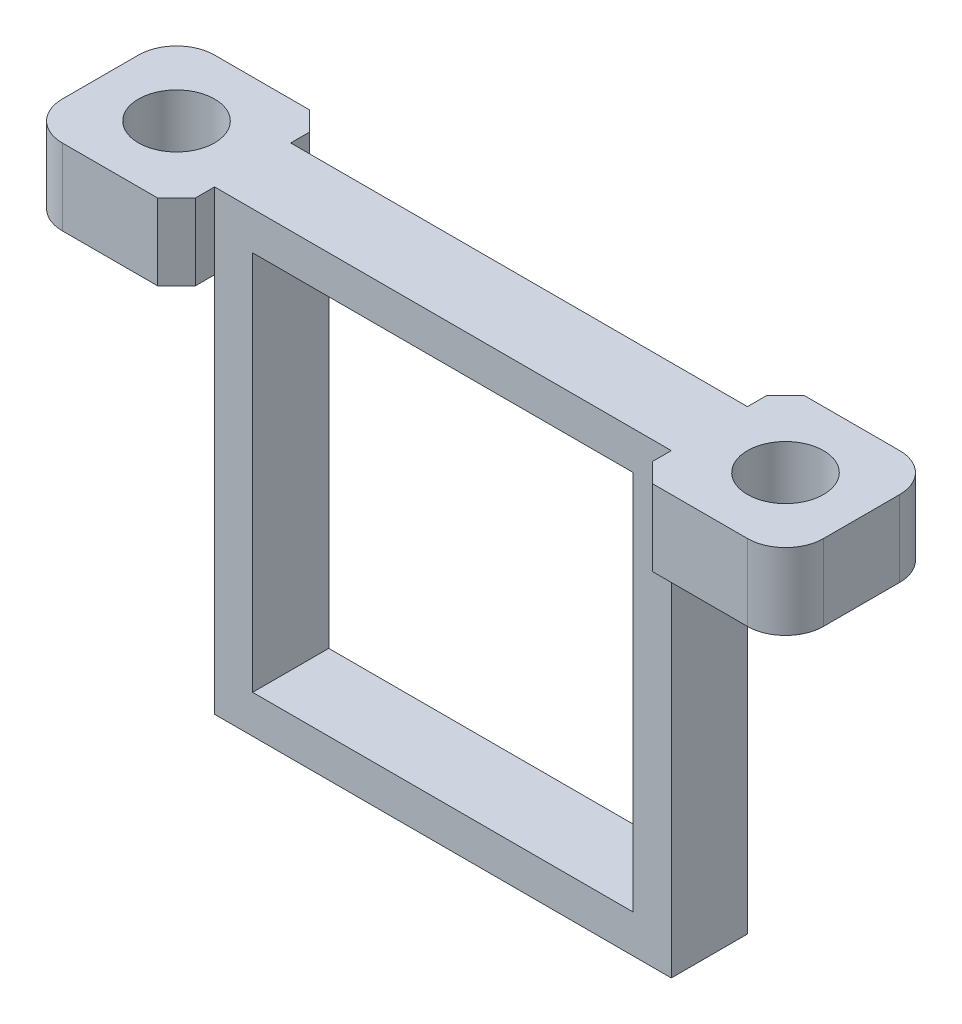
ISO-10303-21;
HEADER;
FILE_DESCRIPTION(('STEP AP214'),'2;1');
FILE_NAME('part.step','',(''),(''),'','','');
FILE_SCHEMA(('AUTOMOTIVE_DESIGN { 1 0 10303 214 1 1 1 1 }'));
ENDSEC;
DATA;
#1=APPLICATION_CONTEXT('core data for automotive mechanical design processes');
#2=APPLICATION_PROTOCOL_DEFINITION('international standard','automotive_design',2000,#1);
#3=PRODUCT_CONTEXT('',#1,'mechanical');
#4=PRODUCT('Part','Part','',(#3));
#5=PRODUCT_RELATED_PRODUCT_CATEGORY('part','',(#4));
#6=PRODUCT_DEFINITION_FORMATION('','',#4);
#7=PRODUCT_DEFINITION_CONTEXT('part definition',#1,'design');
#8=PRODUCT_DEFINITION('design','',#6,#7);
#9=PRODUCT_DEFINITION_SHAPE('','',#8);
#10=(LENGTH_UNIT() NAMED_UNIT(*) SI_UNIT(.MILLI.,.METRE.));
#11=(NAMED_UNIT(*) PLANE_ANGLE_UNIT() SI_UNIT($,.RADIAN.));
#12=(NAMED_UNIT(*) SI_UNIT($,.STERADIAN.) SOLID_ANGLE_UNIT());
#13=UNCERTAINTY_MEASURE_WITH_UNIT(LENGTH_MEASURE(1.E-05),#10,'distance_accuracy_value','');
#14=(GEOMETRIC_REPRESENTATION_CONTEXT(3) GLOBAL_UNCERTAINTY_ASSIGNED_CONTEXT((#13)) GLOBAL_UNIT_ASSIGNED_CONTEXT((#10,
#11,#12)) REPRESENTATION_CONTEXT('',''));
#15=CARTESIAN_POINT('',(0.,0.,0.));
#16=DIRECTION('',(0.,0.,1.));
#17=DIRECTION('',(1.,0.,0.));
#18=AXIS2_PLACEMENT_3D('',#15,#16,#17);
#19=CARTESIAN_POINT('',(12.,0.,4.));
#20=DIRECTION('',(-1.,0.,0.));
#21=DIRECTION('',(0.,0.,1.));
#22=AXIS2_PLACEMENT_3D('',#19,#20,#21);
#23=PLANE('',#22);
#24=DIRECTION('',(0.,0.,-1.));
#25=VECTOR('',#24,1.);
#26=CARTESIAN_POINT('',(12.,8.,-2.));
#27=LINE('',#26,#25);
#28=CARTESIAN_POINT('',(12.,8.,4.));
#29=VERTEX_POINT('',#28);
#30=CARTESIAN_POINT('',(12.,8.,0.));
#31=VERTEX_POINT('',#30);
#32=EDGE_CURVE('E276',#29,#31,#27,.T.);
#33=ORIENTED_EDGE('',*,*,#32,.F.);
#34=DIRECTION('',(0.,1.,0.));
#35=VECTOR('',#34,1.);
#36=CARTESIAN_POINT('',(12.,0.,4.));
#37=LINE('',#36,#35);
#38=CARTESIAN_POINT('',(12.,-12.,4.));
#39=VERTEX_POINT('',#38);
#40=EDGE_CURVE('E440',#39,#29,#37,.T.);
#41=ORIENTED_EDGE('',*,*,#40,.F.);
#42=DIRECTION('',(0.,0.,-1.));
#43=VECTOR('',#42,1.);
#44=CARTESIAN_POINT('',(12.,-12.,4.));
#45=LINE('',#44,#43);
#46=CARTESIAN_POINT('',(12.,-12.,0.));
#47=VERTEX_POINT('',#46);
#48=EDGE_CURVE('E444',#39,#47,#45,.T.);
#49=ORIENTED_EDGE('',*,*,#48,.T.);
#50=DIRECTION('',(0.,1.,0.));
#51=VECTOR('',#50,1.);
#52=CARTESIAN_POINT('',(12.,0.,0.));
#53=LINE('',#52,#51);
#54=EDGE_CURVE('E431',#47,#31,#53,.T.);
#55=ORIENTED_EDGE('',*,*,#54,.T.);
#56=EDGE_LOOP('',(#33,#41,#49,#55));
#57=FACE_BOUND('',#56,.T.);
#58=ADVANCED_FACE('F73',(#57),#23,.F.);
#59=CARTESIAN_POINT('',(-12.,0.,4.));
#60=DIRECTION('',(-1.,0.,0.));
#61=DIRECTION('',(0.,0.,1.));
#62=AXIS2_PLACEMENT_3D('',#59,#60,#61);
#63=PLANE('',#62);
#64=DIRECTION('',(0.,1.,0.));
#65=VECTOR('',#64,1.);
#66=CARTESIAN_POINT('',(-12.,0.,4.));
#67=LINE('',#66,#65);
#68=CARTESIAN_POINT('',(-12.,-12.,4.));
#69=VERTEX_POINT('',#68);
#70=CARTESIAN_POINT('',(-12.,8.,4.));
#71=VERTEX_POINT('',#70);
#72=EDGE_CURVE('E432',#69,#71,#67,.T.);
#73=ORIENTED_EDGE('',*,*,#72,.T.);
#74=DIRECTION('',(0.,0.,-1.));
#75=VECTOR('',#74,1.);
#76=CARTESIAN_POINT('',(-12.,8.,-2.));
#77=LINE('',#76,#75);
#78=CARTESIAN_POINT('',(-12.,8.,0.));
#79=VERTEX_POINT('',#78);
#80=EDGE_CURVE('E328',#71,#79,#77,.T.);
#81=ORIENTED_EDGE('',*,*,#80,.T.);
#82=DIRECTION('',(0.,1.,0.));
#83=VECTOR('',#82,1.);
#84=CARTESIAN_POINT('',(-12.,0.,0.));
#85=LINE('',#84,#83);
#86=CARTESIAN_POINT('',(-12.,-12.,0.));
#87=VERTEX_POINT('',#86);
#88=EDGE_CURVE('E448',#87,#79,#85,.T.);
#89=ORIENTED_EDGE('',*,*,#88,.F.);
#90=DIRECTION('',(0.,0.,-1.));
#91=VECTOR('',#90,1.);
#92=CARTESIAN_POINT('',(-12.,-12.,4.));
#93=LINE('',#92,#91);
#94=EDGE_CURVE('E461',#69,#87,#93,.T.);
#95=ORIENTED_EDGE('',*,*,#94,.F.);
#96=EDGE_LOOP('',(#73,#81,#89,#95));
#97=FACE_BOUND('',#96,.T.);
#98=ADVANCED_FACE('F553',(#97),#63,.T.);
#99=CARTESIAN_POINT('',(0.,12.,4.));
#100=DIRECTION('',(0.,1.,0.));
#101=DIRECTION('',(0.,0.,1.));
#102=AXIS2_PLACEMENT_3D('',#99,#100,#101);
#103=PLANE('',#102);
#104=DIRECTION('',(1.,0.,0.));
#105=VECTOR('',#104,1.);
#106=CARTESIAN_POINT('',(12.,12.,-2.));
#107=LINE('',#106,#105);
#108=CARTESIAN_POINT('',(13.,12.,-2.));
#109=VERTEX_POINT('',#108);
#110=CARTESIAN_POINT('',(18.,12.,-2.));
#111=VERTEX_POINT('',#110);
#112=EDGE_CURVE('E301',#109,#111,#107,.T.);
#113=ORIENTED_EDGE('',*,*,#112,.F.);
#114=DIRECTION('',(0.70710678118655,0.,-0.707106781186545));
#115=VECTOR('',#114,1.);
#116=CARTESIAN_POINT('',(3.49999999999995,12.,7.49999999999998));
#117=LINE('',#116,#115);
#118=CARTESIAN_POINT('',(12.,12.,-1.00000000000001));
#119=VERTEX_POINT('',#118);
#120=EDGE_CURVE('E497',#109,#119,#117,.F.);
#121=ORIENTED_EDGE('',*,*,#120,.T.);
#122=DIRECTION('',(0.,0.,-1.));
#123=VECTOR('',#122,1.);
#124=CARTESIAN_POINT('',(12.,12.,-2.));
#125=LINE('',#124,#123);
#126=CARTESIAN_POINT('',(12.,12.,0.));
#127=VERTEX_POINT('',#126);
#128=EDGE_CURVE('E290',#127,#119,#125,.T.);
#129=ORIENTED_EDGE('',*,*,#128,.F.);
#130=DIRECTION('',(1.,0.,0.));
#131=VECTOR('',#130,1.);
#132=CARTESIAN_POINT('',(0.,12.,0.));
#133=LINE('',#132,#131);
#134=CARTESIAN_POINT('',(-12.,12.,0.));
#135=VERTEX_POINT('',#134);
#136=EDGE_CURVE('E416',#135,#127,#133,.T.);
#137=ORIENTED_EDGE('',*,*,#136,.F.);
#138=DIRECTION('',(0.,0.,-1.));
#139=VECTOR('',#138,1.);
#140=CARTESIAN_POINT('',(-12.,12.,-2.));
#141=LINE('',#140,#139);
#142=CARTESIAN_POINT('',(-12.,12.,-1.));
#143=VERTEX_POINT('',#142);
#144=EDGE_CURVE('E319',#135,#143,#141,.T.);
#145=ORIENTED_EDGE('',*,*,#144,.T.);
#146=DIRECTION('',(0.70710678118655,0.,0.707106781186545));
#147=VECTOR('',#146,1.);
#148=CARTESIAN_POINT('',(-3.49999999999996,12.,7.49999999999998));
#149=LINE('',#148,#147);
#150=CARTESIAN_POINT('',(-13.,12.,-2.));
#151=VERTEX_POINT('',#150);
#152=EDGE_CURVE('E471',#143,#151,#149,.F.);
#153=ORIENTED_EDGE('',*,*,#152,.T.);
#154=DIRECTION('',(-1.,0.,0.));
#155=VECTOR('',#154,1.);
#156=CARTESIAN_POINT('',(-12.,12.,-2.));
#157=LINE('',#156,#155);
#158=CARTESIAN_POINT('',(-18.,12.,-2.));
#159=VERTEX_POINT('',#158);
#160=EDGE_CURVE('E351',#151,#159,#157,.T.);
#161=ORIENTED_EDGE('',*,*,#160,.T.);
#162=CARTESIAN_POINT('',(-18.,12.,0.));
#163=DIRECTION('',(0.,1.,0.));
#164=DIRECTION('',(0.,0.,1.));
#165=AXIS2_PLACEMENT_3D('',#162,#163,#164);
#166=CIRCLE('',#165,2.);
#167=CARTESIAN_POINT('',(-20.,12.,0.));
#168=VERTEX_POINT('',#167);
#169=EDGE_CURVE('E354',#159,#168,#166,.T.);
#170=ORIENTED_EDGE('',*,*,#169,.T.);
#171=DIRECTION('',(0.,0.,1.));
#172=VECTOR('',#171,1.);
#173=CARTESIAN_POINT('',(-20.,12.,0.));
#174=LINE('',#173,#172);
#175=CARTESIAN_POINT('',(-20.,12.,3.99999999999999));
#176=VERTEX_POINT('',#175);
#177=EDGE_CURVE('E358',#168,#176,#174,.T.);
#178=ORIENTED_EDGE('',*,*,#177,.T.);
#179=CARTESIAN_POINT('',(-18.,12.,4.));
#180=DIRECTION('',(0.,1.,0.));
#181=DIRECTION('',(0.,0.,1.));
#182=AXIS2_PLACEMENT_3D('',#179,#180,#181);
#183=CIRCLE('',#182,2.);
#184=CARTESIAN_POINT('',(-18.,12.,6.));
#185=VERTEX_POINT('',#184);
#186=EDGE_CURVE('E362',#176,#185,#183,.T.);
#187=ORIENTED_EDGE('',*,*,#186,.T.);
#188=DIRECTION('',(1.,0.,0.));
#189=VECTOR('',#188,1.);
#190=CARTESIAN_POINT('',(-12.,12.,6.));
#191=LINE('',#190,#189);
#192=CARTESIAN_POINT('',(-13.,12.,6.));
#193=VERTEX_POINT('',#192);
#194=EDGE_CURVE('E366',#185,#193,#191,.T.);
#195=ORIENTED_EDGE('',*,*,#194,.T.);
#196=DIRECTION('',(-0.707106781186545,0.,0.70710678118655));
#197=VECTOR('',#196,1.);
#198=CARTESIAN_POINT('',(-5.50000000000004,12.,-1.5));
#199=LINE('',#198,#197);
#200=CARTESIAN_POINT('',(-12.,12.,5.));
#201=VERTEX_POINT('',#200);
#202=EDGE_CURVE('E468',#193,#201,#199,.F.);
#203=ORIENTED_EDGE('',*,*,#202,.T.);
#204=CARTESIAN_POINT('',(-12.,12.,4.));
#205=VERTEX_POINT('',#204);
#206=EDGE_CURVE('E348',#201,#205,#141,.T.);
#207=ORIENTED_EDGE('',*,*,#206,.T.);
#208=DIRECTION('',(1.,0.,0.));
#209=VECTOR('',#208,1.);
#210=CARTESIAN_POINT('',(0.,12.,4.));
#211=LINE('',#210,#209);
#212=CARTESIAN_POINT('',(12.,12.,4.));
#213=VERTEX_POINT('',#212);
#214=EDGE_CURVE('E426',#205,#213,#211,.T.);
#215=ORIENTED_EDGE('',*,*,#214,.T.);
#216=CARTESIAN_POINT('',(12.,12.,5.));
#217=VERTEX_POINT('',#216);
#218=EDGE_CURVE('E286',#217,#213,#125,.T.);
#219=ORIENTED_EDGE('',*,*,#218,.F.);
#220=DIRECTION('',(-0.707106781186548,0.,-0.707106781186548));
#221=VECTOR('',#220,1.);
#222=CARTESIAN_POINT('',(5.5,12.,-1.5));
#223=LINE('',#222,#221);
#224=CARTESIAN_POINT('',(13.,12.,6.));
#225=VERTEX_POINT('',#224);
#226=EDGE_CURVE('E494',#217,#225,#223,.F.);
#227=ORIENTED_EDGE('',*,*,#226,.T.);
#228=DIRECTION('',(-1.,0.,0.));
#229=VECTOR('',#228,1.);
#230=CARTESIAN_POINT('',(12.,12.,6.));
#231=LINE('',#230,#229);
#232=CARTESIAN_POINT('',(18.,12.,6.));
#233=VERTEX_POINT('',#232);
#234=EDGE_CURVE('E289',#233,#225,#231,.T.);
#235=ORIENTED_EDGE('',*,*,#234,.F.);
#236=CARTESIAN_POINT('',(18.,12.,4.));
#237=DIRECTION('',(0.,-1.,0.));
#238=DIRECTION('',(0.,0.,1.));
#239=AXIS2_PLACEMENT_3D('',#236,#237,#238);
#240=CIRCLE('',#239,2.);
#241=CARTESIAN_POINT('',(20.,12.,3.99999999999999));
#242=VERTEX_POINT('',#241);
#243=EDGE_CURVE('E263',#242,#233,#240,.T.);
#244=ORIENTED_EDGE('',*,*,#243,.F.);
#245=DIRECTION('',(0.,0.,1.));
#246=VECTOR('',#245,1.);
#247=CARTESIAN_POINT('',(20.,12.,0.));
#248=LINE('',#247,#246);
#249=CARTESIAN_POINT('',(20.,12.,0.));
#250=VERTEX_POINT('',#249);
#251=EDGE_CURVE('E295',#250,#242,#248,.T.);
#252=ORIENTED_EDGE('',*,*,#251,.F.);
#253=CARTESIAN_POINT('',(18.,12.,0.));
#254=DIRECTION('',(0.,-1.,0.));
#255=DIRECTION('',(0.,0.,1.));
#256=AXIS2_PLACEMENT_3D('',#253,#254,#255);
#257=CIRCLE('',#256,2.);
#258=EDGE_CURVE('E298',#111,#250,#257,.T.);
#259=ORIENTED_EDGE('',*,*,#258,.F.);
#260=EDGE_LOOP('',(#113,#121,#129,#137,#145,#153,#161,#170,#178,#187,#195,#203,#207,#215,#219,
#227,#235,#244,#252,#259));
#261=FACE_BOUND('',#260,.T.);
#262=CARTESIAN_POINT('',(-16.,12.,2.));
#263=DIRECTION('',(0.,1.,0.));
#264=DIRECTION('',(0.,0.,1.));
#265=AXIS2_PLACEMENT_3D('',#262,#263,#264);
#266=CIRCLE('',#265,2.);
#267=CARTESIAN_POINT('',(-16.,12.,4.));
#268=VERTEX_POINT('',#267);
#269=EDGE_CURVE('E308',#268,#268,#266,.T.);
#270=ORIENTED_EDGE('',*,*,#269,.F.);
#271=EDGE_LOOP('',(#270));
#272=FACE_BOUND('',#271,.T.);
#273=CARTESIAN_POINT('',(16.,12.,2.));
#274=DIRECTION('',(0.,-1.,0.));
#275=DIRECTION('',(0.,0.,1.));
#276=AXIS2_PLACEMENT_3D('',#273,#274,#275);
#277=CIRCLE('',#276,2.);
#278=CARTESIAN_POINT('',(16.,12.,4.));
#279=VERTEX_POINT('',#278);
#280=EDGE_CURVE('E918',#279,#279,#277,.T.);
#281=ORIENTED_EDGE('',*,*,#280,.T.);
#282=EDGE_LOOP('',(#281));
#283=FACE_BOUND('',#282,.T.);
#284=ADVANCED_FACE('F518',(#261,#272,#283),#103,.T.);
#285=CARTESIAN_POINT('',(0.,-12.,4.));
#286=DIRECTION('',(0.,1.,0.));
#287=DIRECTION('',(0.,0.,1.));
#288=AXIS2_PLACEMENT_3D('',#285,#286,#287);
#289=PLANE('',#288);
#290=DIRECTION('',(1.,0.,0.));
#291=VECTOR('',#290,1.);
#292=CARTESIAN_POINT('',(0.,-12.,0.));
#293=LINE('',#292,#291);
#294=EDGE_CURVE('E452',#87,#47,#293,.T.);
#295=ORIENTED_EDGE('',*,*,#294,.T.);
#296=ORIENTED_EDGE('',*,*,#48,.F.);
#297=DIRECTION('',(1.,0.,0.));
#298=VECTOR('',#297,1.);
#299=CARTESIAN_POINT('',(0.,-12.,4.));
#300=LINE('',#299,#298);
#301=EDGE_CURVE('E436',#69,#39,#300,.T.);
#302=ORIENTED_EDGE('',*,*,#301,.F.);
#303=ORIENTED_EDGE('',*,*,#94,.T.);
#304=EDGE_LOOP('',(#295,#296,#302,#303));
#305=FACE_BOUND('',#304,.T.);
#306=ADVANCED_FACE('F600',(#305),#289,.F.);
#307=CARTESIAN_POINT('',(0.,0.,4.));
#308=DIRECTION('',(0.,0.,1.));
#309=DIRECTION('',(1.,0.,0.));
#310=AXIS2_PLACEMENT_3D('',#307,#308,#309);
#311=PLANE('',#310);
#312=DIRECTION('',(1.,0.,0.));
#313=VECTOR('',#312,1.);
#314=CARTESIAN_POINT('',(-10.,10.,4.));
#315=LINE('',#314,#313);
#316=CARTESIAN_POINT('',(-10.,10.,4.));
#317=VERTEX_POINT('',#316);
#318=CARTESIAN_POINT('',(10.,10.,4.));
#319=VERTEX_POINT('',#318);
#320=EDGE_CURVE('E383',#317,#319,#315,.T.);
#321=ORIENTED_EDGE('',*,*,#320,.T.);
#322=DIRECTION('',(0.,1.,0.));
#323=VECTOR('',#322,1.);
#324=CARTESIAN_POINT('',(10.,-10.,4.));
#325=LINE('',#324,#323);
#326=CARTESIAN_POINT('',(10.,-10.,4.));
#327=VERTEX_POINT('',#326);
#328=EDGE_CURVE('E387',#327,#319,#325,.T.);
#329=ORIENTED_EDGE('',*,*,#328,.F.);
#330=DIRECTION('',(1.,0.,0.));
#331=VECTOR('',#330,1.);
#332=CARTESIAN_POINT('',(-10.,-10.,4.));
#333=LINE('',#332,#331);
#334=CARTESIAN_POINT('',(-10.,-10.,4.));
#335=VERTEX_POINT('',#334);
#336=EDGE_CURVE('E391',#335,#327,#333,.T.);
#337=ORIENTED_EDGE('',*,*,#336,.F.);
#338=DIRECTION('',(0.,1.,0.));
#339=VECTOR('',#338,1.);
#340=CARTESIAN_POINT('',(-10.,-10.,4.));
#341=LINE('',#340,#339);
#342=EDGE_CURVE('E395',#335,#317,#341,.T.);
#343=ORIENTED_EDGE('',*,*,#342,.T.);
#344=EDGE_LOOP('',(#321,#329,#337,#343));
#345=FACE_BOUND('',#344,.T.);
#346=ORIENTED_EDGE('',*,*,#214,.F.);
#347=EDGE_CURVE('E430',#71,#205,#67,.T.);
#348=ORIENTED_EDGE('',*,*,#347,.F.);
#349=ORIENTED_EDGE('',*,*,#72,.F.);
#350=ORIENTED_EDGE('',*,*,#301,.T.);
#351=ORIENTED_EDGE('',*,*,#40,.T.);
#352=EDGE_CURVE('E439',#29,#213,#37,.T.);
#353=ORIENTED_EDGE('',*,*,#352,.T.);
#354=EDGE_LOOP('',(#346,#348,#349,#350,#351,#353));
#355=FACE_BOUND('',#354,.T.);
#356=ADVANCED_FACE('F525',(#345,#355),#311,.T.);
#357=CARTESIAN_POINT('',(0.,0.,0.));
#358=DIRECTION('',(0.,0.,1.));
#359=DIRECTION('',(1.,0.,0.));
#360=AXIS2_PLACEMENT_3D('',#357,#358,#359);
#361=PLANE('',#360);
#362=DIRECTION('',(0.,1.,0.));
#363=VECTOR('',#362,1.);
#364=CARTESIAN_POINT('',(10.,-10.,0.));
#365=LINE('',#364,#363);
#366=CARTESIAN_POINT('',(10.,-10.,0.));
#367=VERTEX_POINT('',#366);
#368=CARTESIAN_POINT('',(10.,10.,0.));
#369=VERTEX_POINT('',#368);
#370=EDGE_CURVE('E402',#367,#369,#365,.T.);
#371=ORIENTED_EDGE('',*,*,#370,.T.);
#372=DIRECTION('',(1.,0.,0.));
#373=VECTOR('',#372,1.);
#374=CARTESIAN_POINT('',(-10.,10.,0.));
#375=LINE('',#374,#373);
#376=CARTESIAN_POINT('',(-10.,10.,0.));
#377=VERTEX_POINT('',#376);
#378=EDGE_CURVE('E373',#377,#369,#375,.T.);
#379=ORIENTED_EDGE('',*,*,#378,.F.);
#380=DIRECTION('',(0.,1.,0.));
#381=VECTOR('',#380,1.);
#382=CARTESIAN_POINT('',(-10.,-10.,0.));
#383=LINE('',#382,#381);
#384=CARTESIAN_POINT('',(-10.,-10.,0.));
#385=VERTEX_POINT('',#384);
#386=EDGE_CURVE('E388',#385,#377,#383,.T.);
#387=ORIENTED_EDGE('',*,*,#386,.F.);
#388=DIRECTION('',(1.,0.,0.));
#389=VECTOR('',#388,1.);
#390=CARTESIAN_POINT('',(-10.,-10.,0.));
#391=LINE('',#390,#389);
#392=EDGE_CURVE('E406',#385,#367,#391,.T.);
#393=ORIENTED_EDGE('',*,*,#392,.T.);
#394=EDGE_LOOP('',(#371,#379,#387,#393));
#395=FACE_BOUND('',#394,.T.);
#396=ORIENTED_EDGE('',*,*,#136,.T.);
#397=EDGE_CURVE('E455',#31,#127,#53,.T.);
#398=ORIENTED_EDGE('',*,*,#397,.F.);
#399=ORIENTED_EDGE('',*,*,#54,.F.);
#400=ORIENTED_EDGE('',*,*,#294,.F.);
#401=ORIENTED_EDGE('',*,*,#88,.T.);
#402=EDGE_CURVE('E447',#79,#135,#85,.T.);
#403=ORIENTED_EDGE('',*,*,#402,.T.);
#404=EDGE_LOOP('',(#396,#398,#399,#400,#401,#403));
#405=FACE_BOUND('',#404,.T.);
#406=ADVANCED_FACE('F547',(#395,#405),#361,.F.);
#407=CARTESIAN_POINT('',(-10.,10.,4.));
#408=DIRECTION('',(0.,1.,0.));
#409=DIRECTION('',(0.,0.,1.));
#410=AXIS2_PLACEMENT_3D('',#407,#408,#409);
#411=PLANE('',#410);
#412=ORIENTED_EDGE('',*,*,#378,.T.);
#413=DIRECTION('',(0.,0.,-1.));
#414=VECTOR('',#413,1.);
#415=CARTESIAN_POINT('',(10.,10.,4.));
#416=LINE('',#415,#414);
#417=EDGE_CURVE('E399',#319,#369,#416,.T.);
#418=ORIENTED_EDGE('',*,*,#417,.F.);
#419=ORIENTED_EDGE('',*,*,#320,.F.);
#420=DIRECTION('',(0.,0.,-1.));
#421=VECTOR('',#420,1.);
#422=CARTESIAN_POINT('',(-10.,10.,4.));
#423=LINE('',#422,#421);
#424=EDGE_CURVE('E413',#317,#377,#423,.T.);
#425=ORIENTED_EDGE('',*,*,#424,.T.);
#426=EDGE_LOOP('',(#412,#418,#419,#425));
#427=FACE_BOUND('',#426,.T.);
#428=ADVANCED_FACE('F671',(#427),#411,.F.);
#429=CARTESIAN_POINT('',(-10.,-10.,4.));
#430=DIRECTION('',(-1.,0.,0.));
#431=DIRECTION('',(0.,0.,1.));
#432=AXIS2_PLACEMENT_3D('',#429,#430,#431);
#433=PLANE('',#432);
#434=ORIENTED_EDGE('',*,*,#386,.T.);
#435=ORIENTED_EDGE('',*,*,#424,.F.);
#436=ORIENTED_EDGE('',*,*,#342,.F.);
#437=DIRECTION('',(0.,0.,-1.));
#438=VECTOR('',#437,1.);
#439=CARTESIAN_POINT('',(-10.,-10.,4.));
#440=LINE('',#439,#438);
#441=EDGE_CURVE('E417',#335,#385,#440,.T.);
#442=ORIENTED_EDGE('',*,*,#441,.T.);
#443=EDGE_LOOP('',(#434,#435,#436,#442));
#444=FACE_BOUND('',#443,.T.);
#445=ADVANCED_FACE('F667',(#444),#433,.F.);
#446=CARTESIAN_POINT('',(-10.,-10.,4.));
#447=DIRECTION('',(0.,1.,0.));
#448=DIRECTION('',(0.,0.,1.));
#449=AXIS2_PLACEMENT_3D('',#446,#447,#448);
#450=PLANE('',#449);
#451=ORIENTED_EDGE('',*,*,#392,.F.);
#452=ORIENTED_EDGE('',*,*,#441,.F.);
#453=ORIENTED_EDGE('',*,*,#336,.T.);
#454=DIRECTION('',(0.,0.,-1.));
#455=VECTOR('',#454,1.);
#456=CARTESIAN_POINT('',(10.,-10.,4.));
#457=LINE('',#456,#455);
#458=EDGE_CURVE('E420',#327,#367,#457,.T.);
#459=ORIENTED_EDGE('',*,*,#458,.T.);
#460=EDGE_LOOP('',(#451,#452,#453,#459));
#461=FACE_BOUND('',#460,.T.);
#462=ADVANCED_FACE('F670',(#461),#450,.T.);
#463=CARTESIAN_POINT('',(10.,-10.,4.));
#464=DIRECTION('',(-1.,0.,0.));
#465=DIRECTION('',(0.,0.,1.));
#466=AXIS2_PLACEMENT_3D('',#463,#464,#465);
#467=PLANE('',#466);
#468=ORIENTED_EDGE('',*,*,#370,.F.);
#469=ORIENTED_EDGE('',*,*,#458,.F.);
#470=ORIENTED_EDGE('',*,*,#328,.T.);
#471=ORIENTED_EDGE('',*,*,#417,.T.);
#472=EDGE_LOOP('',(#468,#469,#470,#471));
#473=FACE_BOUND('',#472,.T.);
#474=ADVANCED_FACE('F663',(#473),#467,.T.);
#475=CARTESIAN_POINT('',(-12.,8.,-2.));
#476=DIRECTION('',(1.,0.,0.));
#477=DIRECTION('',(0.,0.,-1.));
#478=AXIS2_PLACEMENT_3D('',#475,#476,#477);
#479=PLANE('',#478);
#480=CARTESIAN_POINT('',(-12.,8.,-1.));
#481=VERTEX_POINT('',#480);
#482=EDGE_CURVE('E327',#79,#481,#77,.T.);
#483=ORIENTED_EDGE('',*,*,#482,.T.);
#484=DIRECTION('',(0.,1.,0.));
#485=VECTOR('',#484,1.);
#486=CARTESIAN_POINT('',(-12.,8.,-1.));
#487=LINE('',#486,#485);
#488=EDGE_CURVE('E464',#481,#143,#487,.T.);
#489=ORIENTED_EDGE('',*,*,#488,.T.);
#490=ORIENTED_EDGE('',*,*,#144,.F.);
#491=ORIENTED_EDGE('',*,*,#402,.F.);
#492=EDGE_LOOP('',(#483,#489,#490,#491));
#493=FACE_BOUND('',#492,.T.);
#494=ADVANCED_FACE('F543',(#493),#479,.T.);
#495=ORIENTED_EDGE('',*,*,#206,.F.);
#496=DIRECTION('',(0.,-1.,0.));
#497=VECTOR('',#496,1.);
#498=CARTESIAN_POINT('',(-12.,8.,5.));
#499=LINE('',#498,#497);
#500=CARTESIAN_POINT('',(-12.,8.,5.));
#501=VERTEX_POINT('',#500);
#502=EDGE_CURVE('E487',#201,#501,#499,.T.);
#503=ORIENTED_EDGE('',*,*,#502,.T.);
#504=EDGE_CURVE('E323',#501,#71,#77,.T.);
#505=ORIENTED_EDGE('',*,*,#504,.T.);
#506=ORIENTED_EDGE('',*,*,#347,.T.);
#507=EDGE_LOOP('',(#495,#503,#505,#506));
#508=FACE_BOUND('',#507,.T.);
#509=ADVANCED_FACE('F655',(#508),#479,.T.);
#510=CARTESIAN_POINT('',(-12.,8.,6.));
#511=DIRECTION('',(0.,0.,1.));
#512=DIRECTION('',(1.,0.,0.));
#513=AXIS2_PLACEMENT_3D('',#510,#511,#512);
#514=PLANE('',#513);
#515=DIRECTION('',(1.,0.,0.));
#516=VECTOR('',#515,1.);
#517=CARTESIAN_POINT('',(-12.,8.,6.));
#518=LINE('',#517,#516);
#519=CARTESIAN_POINT('',(-18.,8.,6.));
#520=VERTEX_POINT('',#519);
#521=CARTESIAN_POINT('',(-13.,8.,6.));
#522=VERTEX_POINT('',#521);
#523=EDGE_CURVE('E343',#520,#522,#518,.T.);
#524=ORIENTED_EDGE('',*,*,#523,.T.);
#525=DIRECTION('',(0.,1.,0.));
#526=VECTOR('',#525,1.);
#527=CARTESIAN_POINT('',(-13.,8.,6.));
#528=LINE('',#527,#526);
#529=EDGE_CURVE('E483',#522,#193,#528,.T.);
#530=ORIENTED_EDGE('',*,*,#529,.T.);
#531=ORIENTED_EDGE('',*,*,#194,.F.);
#532=DIRECTION('',(0.,1.,0.));
#533=VECTOR('',#532,1.);
#534=CARTESIAN_POINT('',(-18.,8.,6.));
#535=LINE('',#534,#533);
#536=EDGE_CURVE('E370',#520,#185,#535,.T.);
#537=ORIENTED_EDGE('',*,*,#536,.F.);
#538=EDGE_LOOP('',(#524,#530,#531,#537));
#539=FACE_BOUND('',#538,.T.);
#540=ADVANCED_FACE('F636',(#539),#514,.T.);
#541=CARTESIAN_POINT('',(-18.,8.,4.));
#542=DIRECTION('',(0.,1.,0.));
#543=DIRECTION('',(0.,0.,1.));
#544=AXIS2_PLACEMENT_3D('',#541,#542,#543);
#545=CYLINDRICAL_SURFACE('',#544,2.);
#546=ORIENTED_EDGE('',*,*,#186,.F.);
#547=DIRECTION('',(0.,1.,0.));
#548=VECTOR('',#547,1.);
#549=CARTESIAN_POINT('',(-20.,8.,3.99999999999999));
#550=LINE('',#549,#548);
#551=CARTESIAN_POINT('',(-20.,8.,3.99999999999999));
#552=VERTEX_POINT('',#551);
#553=EDGE_CURVE('E374',#552,#176,#550,.T.);
#554=ORIENTED_EDGE('',*,*,#553,.F.);
#555=CARTESIAN_POINT('',(-18.,8.,4.));
#556=DIRECTION('',(0.,1.,0.));
#557=DIRECTION('',(0.,0.,1.));
#558=AXIS2_PLACEMENT_3D('',#555,#556,#557);
#559=CIRCLE('',#558,2.);
#560=EDGE_CURVE('E339',#552,#520,#559,.T.);
#561=ORIENTED_EDGE('',*,*,#560,.T.);
#562=ORIENTED_EDGE('',*,*,#536,.T.);
#563=EDGE_LOOP('',(#546,#554,#561,#562));
#564=FACE_BOUND('',#563,.T.);
#565=ADVANCED_FACE('F640',(#564),#545,.T.);
#566=CARTESIAN_POINT('',(-20.,8.,0.));
#567=DIRECTION('',(-1.,0.,0.));
#568=DIRECTION('',(0.,0.,1.));
#569=AXIS2_PLACEMENT_3D('',#566,#567,#568);
#570=PLANE('',#569);
#571=ORIENTED_EDGE('',*,*,#177,.F.);
#572=DIRECTION('',(0.,1.,0.));
#573=VECTOR('',#572,1.);
#574=CARTESIAN_POINT('',(-20.,8.,0.));
#575=LINE('',#574,#573);
#576=CARTESIAN_POINT('',(-20.,8.,0.));
#577=VERTEX_POINT('',#576);
#578=EDGE_CURVE('E377',#577,#168,#575,.T.);
#579=ORIENTED_EDGE('',*,*,#578,.F.);
#580=DIRECTION('',(0.,0.,1.));
#581=VECTOR('',#580,1.);
#582=CARTESIAN_POINT('',(-20.,8.,0.));
#583=LINE('',#582,#581);
#584=EDGE_CURVE('E335',#577,#552,#583,.T.);
#585=ORIENTED_EDGE('',*,*,#584,.T.);
#586=ORIENTED_EDGE('',*,*,#553,.T.);
#587=EDGE_LOOP('',(#571,#579,#585,#586));
#588=FACE_BOUND('',#587,.T.);
#589=ADVANCED_FACE('F645',(#588),#570,.T.);
#590=CARTESIAN_POINT('',(-18.,8.,0.));
#591=DIRECTION('',(0.,1.,0.));
#592=DIRECTION('',(0.,0.,1.));
#593=AXIS2_PLACEMENT_3D('',#590,#591,#592);
#594=CYLINDRICAL_SURFACE('',#593,2.);
#595=ORIENTED_EDGE('',*,*,#169,.F.);
#596=DIRECTION('',(0.,1.,0.));
#597=VECTOR('',#596,1.);
#598=CARTESIAN_POINT('',(-18.,8.,-2.));
#599=LINE('',#598,#597);
#600=CARTESIAN_POINT('',(-18.,8.,-2.));
#601=VERTEX_POINT('',#600);
#602=EDGE_CURVE('E347',#601,#159,#599,.T.);
#603=ORIENTED_EDGE('',*,*,#602,.F.);
#604=CARTESIAN_POINT('',(-18.,8.,0.));
#605=DIRECTION('',(0.,1.,0.));
#606=DIRECTION('',(0.,0.,1.));
#607=AXIS2_PLACEMENT_3D('',#604,#605,#606);
#608=CIRCLE('',#607,2.);
#609=EDGE_CURVE('E331',#601,#577,#608,.T.);
#610=ORIENTED_EDGE('',*,*,#609,.T.);
#611=ORIENTED_EDGE('',*,*,#578,.T.);
#612=EDGE_LOOP('',(#595,#603,#610,#611));
#613=FACE_BOUND('',#612,.T.);
#614=ADVANCED_FACE('F648',(#613),#594,.T.);
#615=CARTESIAN_POINT('',(-12.,8.,-2.));
#616=DIRECTION('',(0.,0.,-1.));
#617=DIRECTION('',(-1.,0.,0.));
#618=AXIS2_PLACEMENT_3D('',#615,#616,#617);
#619=PLANE('',#618);
#620=ORIENTED_EDGE('',*,*,#160,.F.);
#621=DIRECTION('',(0.,-1.,0.));
#622=VECTOR('',#621,1.);
#623=CARTESIAN_POINT('',(-13.,8.,-2.));
#624=LINE('',#623,#622);
#625=CARTESIAN_POINT('',(-13.,8.,-2.));
#626=VERTEX_POINT('',#625);
#627=EDGE_CURVE('E474',#151,#626,#624,.T.);
#628=ORIENTED_EDGE('',*,*,#627,.T.);
#629=DIRECTION('',(-1.,0.,0.));
#630=VECTOR('',#629,1.);
#631=CARTESIAN_POINT('',(-12.,8.,-2.));
#632=LINE('',#631,#630);
#633=EDGE_CURVE('E326',#626,#601,#632,.T.);
#634=ORIENTED_EDGE('',*,*,#633,.T.);
#635=ORIENTED_EDGE('',*,*,#602,.T.);
#636=EDGE_LOOP('',(#620,#628,#634,#635));
#637=FACE_BOUND('',#636,.T.);
#638=ADVANCED_FACE('F653',(#637),#619,.T.);
#639=CARTESIAN_POINT('',(-18.,8.,4.));
#640=DIRECTION('',(0.,1.,0.));
#641=DIRECTION('',(0.,0.,1.));
#642=AXIS2_PLACEMENT_3D('',#639,#640,#641);
#643=PLANE('',#642);
#644=CARTESIAN_POINT('',(-16.,8.,2.));
#645=DIRECTION('',(0.,1.,0.));
#646=DIRECTION('',(0.,0.,1.));
#647=AXIS2_PLACEMENT_3D('',#644,#645,#646);
#648=CIRCLE('',#647,2.);
#649=CARTESIAN_POINT('',(-16.,8.,4.));
#650=VERTEX_POINT('',#649);
#651=EDGE_CURVE('E315',#650,#650,#648,.T.);
#652=ORIENTED_EDGE('',*,*,#651,.T.);
#653=EDGE_LOOP('',(#652));
#654=FACE_BOUND('',#653,.T.);
#655=ORIENTED_EDGE('',*,*,#633,.F.);
#656=DIRECTION('',(-0.70710678118655,0.,-0.707106781186545));
#657=VECTOR('',#656,1.);
#658=CARTESIAN_POINT('',(-12.,8.,-1.));
#659=LINE('',#658,#657);
#660=EDGE_CURVE('E480',#626,#481,#659,.F.);
#661=ORIENTED_EDGE('',*,*,#660,.T.);
#662=ORIENTED_EDGE('',*,*,#482,.F.);
#663=ORIENTED_EDGE('',*,*,#80,.F.);
#664=ORIENTED_EDGE('',*,*,#504,.F.);
#665=DIRECTION('',(0.707106781186545,0.,-0.70710678118655));
#666=VECTOR('',#665,1.);
#667=CARTESIAN_POINT('',(-13.,8.,6.));
#668=LINE('',#667,#666);
#669=EDGE_CURVE('E477',#501,#522,#668,.F.);
#670=ORIENTED_EDGE('',*,*,#669,.T.);
#671=ORIENTED_EDGE('',*,*,#523,.F.);
#672=ORIENTED_EDGE('',*,*,#560,.F.);
#673=ORIENTED_EDGE('',*,*,#584,.F.);
#674=ORIENTED_EDGE('',*,*,#609,.F.);
#675=EDGE_LOOP('',(#655,#661,#662,#663,#664,#670,#671,#672,#673,#674));
#676=FACE_BOUND('',#675,.T.);
#677=ADVANCED_FACE('F633',(#654,#676),#643,.F.);
#678=CARTESIAN_POINT('',(-16.,8.,2.));
#679=DIRECTION('',(0.,1.,0.));
#680=DIRECTION('',(0.,0.,1.));
#681=AXIS2_PLACEMENT_3D('',#678,#679,#680);
#682=CYLINDRICAL_SURFACE('',#681,2.);
#683=ORIENTED_EDGE('',*,*,#651,.F.);
#684=EDGE_LOOP('',(#683));
#685=FACE_BOUND('',#684,.T.);
#686=ORIENTED_EDGE('',*,*,#269,.T.);
#687=EDGE_LOOP('',(#686));
#688=FACE_BOUND('',#687,.T.);
#689=ADVANCED_FACE('F613',(#685,#688),#682,.F.);
#690=CARTESIAN_POINT('',(-12.,8.,-1.));
#691=DIRECTION('',(-0.707106781186545,0.,0.70710678118655));
#692=DIRECTION('',(0.,1.,0.));
#693=AXIS2_PLACEMENT_3D('',#690,#691,#692);
#694=PLANE('',#693);
#695=ORIENTED_EDGE('',*,*,#660,.F.);
#696=ORIENTED_EDGE('',*,*,#627,.F.);
#697=ORIENTED_EDGE('',*,*,#152,.F.);
#698=ORIENTED_EDGE('',*,*,#488,.F.);
#699=EDGE_LOOP('',(#695,#696,#697,#698));
#700=FACE_BOUND('',#699,.T.);
#701=ADVANCED_FACE('F606',(#700),#694,.F.);
#702=CARTESIAN_POINT('',(-13.,8.,6.));
#703=DIRECTION('',(-0.70710678118655,0.,-0.707106781186545));
#704=DIRECTION('',(0.,1.,0.));
#705=AXIS2_PLACEMENT_3D('',#702,#703,#704);
#706=PLANE('',#705);
#707=ORIENTED_EDGE('',*,*,#669,.F.);
#708=ORIENTED_EDGE('',*,*,#502,.F.);
#709=ORIENTED_EDGE('',*,*,#202,.F.);
#710=ORIENTED_EDGE('',*,*,#529,.F.);
#711=EDGE_LOOP('',(#707,#708,#709,#710));
#712=FACE_BOUND('',#711,.T.);
#713=ADVANCED_FACE('F612',(#712),#706,.F.);
#714=CARTESIAN_POINT('',(12.,8.,-2.));
#715=DIRECTION('',(1.,0.,0.));
#716=DIRECTION('',(0.,0.,-1.));
#717=AXIS2_PLACEMENT_3D('',#714,#715,#716);
#718=PLANE('',#717);
#719=ORIENTED_EDGE('',*,*,#128,.T.);
#720=DIRECTION('',(0.,-1.,0.));
#721=VECTOR('',#720,1.);
#722=CARTESIAN_POINT('',(12.,8.,-1.00000000000001));
#723=LINE('',#722,#721);
#724=CARTESIAN_POINT('',(12.,8.,-1.00000000000001));
#725=VERTEX_POINT('',#724);
#726=EDGE_CURVE('E500',#119,#725,#723,.T.);
#727=ORIENTED_EDGE('',*,*,#726,.T.);
#728=EDGE_CURVE('E274',#31,#725,#27,.T.);
#729=ORIENTED_EDGE('',*,*,#728,.F.);
#730=ORIENTED_EDGE('',*,*,#397,.T.);
#731=EDGE_LOOP('',(#719,#727,#729,#730));
#732=FACE_BOUND('',#731,.T.);
#733=ADVANCED_FACE('F618',(#732),#718,.F.);
#734=CARTESIAN_POINT('',(18.,8.,4.));
#735=DIRECTION('',(0.,1.,0.));
#736=DIRECTION('',(0.,0.,1.));
#737=AXIS2_PLACEMENT_3D('',#734,#735,#736);
#738=PLANE('',#737);
#739=ORIENTED_EDGE('',*,*,#728,.T.);
#740=DIRECTION('',(-0.70710678118655,0.,0.707106781186545));
#741=VECTOR('',#740,1.);
#742=CARTESIAN_POINT('',(13.,8.,-2.));
#743=LINE('',#742,#741);
#744=CARTESIAN_POINT('',(13.,8.,-2.));
#745=VERTEX_POINT('',#744);
#746=EDGE_CURVE('E505',#725,#745,#743,.F.);
#747=ORIENTED_EDGE('',*,*,#746,.T.);
#748=DIRECTION('',(1.,0.,0.));
#749=VECTOR('',#748,1.);
#750=CARTESIAN_POINT('',(12.,8.,-2.));
#751=LINE('',#750,#749);
#752=CARTESIAN_POINT('',(18.,8.,-2.));
#753=VERTEX_POINT('',#752);
#754=EDGE_CURVE('E267',#745,#753,#751,.T.);
#755=ORIENTED_EDGE('',*,*,#754,.T.);
#756=CARTESIAN_POINT('',(18.,8.,0.));
#757=DIRECTION('',(0.,-1.,0.));
#758=DIRECTION('',(0.,0.,1.));
#759=AXIS2_PLACEMENT_3D('',#756,#757,#758);
#760=CIRCLE('',#759,2.);
#761=CARTESIAN_POINT('',(20.,8.,0.));
#762=VERTEX_POINT('',#761);
#763=EDGE_CURVE('E281',#753,#762,#760,.T.);
#764=ORIENTED_EDGE('',*,*,#763,.T.);
#765=DIRECTION('',(0.,0.,1.));
#766=VECTOR('',#765,1.);
#767=CARTESIAN_POINT('',(20.,8.,0.));
#768=LINE('',#767,#766);
#769=CARTESIAN_POINT('',(20.,8.,3.99999999999999));
#770=VERTEX_POINT('',#769);
#771=EDGE_CURVE('E253',#762,#770,#768,.T.);
#772=ORIENTED_EDGE('',*,*,#771,.T.);
#773=CARTESIAN_POINT('',(18.,8.,4.));
#774=DIRECTION('',(0.,-1.,0.));
#775=DIRECTION('',(0.,0.,1.));
#776=AXIS2_PLACEMENT_3D('',#773,#774,#775);
#777=CIRCLE('',#776,2.);
#778=CARTESIAN_POINT('',(18.,8.,6.));
#779=VERTEX_POINT('',#778);
#780=EDGE_CURVE('E246',#770,#779,#777,.T.);
#781=ORIENTED_EDGE('',*,*,#780,.T.);
#782=DIRECTION('',(-1.,0.,0.));
#783=VECTOR('',#782,1.);
#784=CARTESIAN_POINT('',(12.,8.,6.));
#785=LINE('',#784,#783);
#786=CARTESIAN_POINT('',(13.,8.,6.));
#787=VERTEX_POINT('',#786);
#788=EDGE_CURVE('E251',#779,#787,#785,.T.);
#789=ORIENTED_EDGE('',*,*,#788,.T.);
#790=DIRECTION('',(0.707106781186548,0.,0.707106781186548));
#791=VECTOR('',#790,1.);
#792=CARTESIAN_POINT('',(12.,8.,5.));
#793=LINE('',#792,#791);
#794=CARTESIAN_POINT('',(12.,8.,5.));
#795=VERTEX_POINT('',#794);
#796=EDGE_CURVE('E95',#787,#795,#793,.F.);
#797=ORIENTED_EDGE('',*,*,#796,.T.);
#798=EDGE_CURVE('E271',#795,#29,#27,.T.);
#799=ORIENTED_EDGE('',*,*,#798,.T.);
#800=ORIENTED_EDGE('',*,*,#32,.T.);
#801=EDGE_LOOP('',(#739,#747,#755,#764,#772,#781,#789,#797,#799,#800));
#802=FACE_BOUND('',#801,.T.);
#803=CARTESIAN_POINT('',(16.,8.,2.));
#804=DIRECTION('',(0.,-1.,0.));
#805=DIRECTION('',(0.,0.,1.));
#806=AXIS2_PLACEMENT_3D('',#803,#804,#805);
#807=CIRCLE('',#806,2.);
#808=CARTESIAN_POINT('',(16.,8.,4.));
#809=VERTEX_POINT('',#808);
#810=EDGE_CURVE('E921',#809,#809,#807,.T.);
#811=ORIENTED_EDGE('',*,*,#810,.F.);
#812=EDGE_LOOP('',(#811));
#813=FACE_BOUND('',#812,.T.);
#814=ADVANCED_FACE('F249',(#802,#813),#738,.F.);
#815=ORIENTED_EDGE('',*,*,#798,.F.);
#816=DIRECTION('',(0.,1.,0.));
#817=VECTOR('',#816,1.);
#818=CARTESIAN_POINT('',(12.,8.,5.));
#819=LINE('',#818,#817);
#820=EDGE_CURVE('E83',#795,#217,#819,.T.);
#821=ORIENTED_EDGE('',*,*,#820,.T.);
#822=ORIENTED_EDGE('',*,*,#218,.T.);
#823=ORIENTED_EDGE('',*,*,#352,.F.);
#824=EDGE_LOOP('',(#815,#821,#822,#823));
#825=FACE_BOUND('',#824,.T.);
#826=ADVANCED_FACE('F512',(#825),#718,.F.);
#827=CARTESIAN_POINT('',(12.,8.,-2.));
#828=DIRECTION('',(0.,0.,1.));
#829=DIRECTION('',(1.,0.,0.));
#830=AXIS2_PLACEMENT_3D('',#827,#828,#829);
#831=PLANE('',#830);
#832=ORIENTED_EDGE('',*,*,#754,.F.);
#833=DIRECTION('',(0.,1.,0.));
#834=VECTOR('',#833,1.);
#835=CARTESIAN_POINT('',(13.,8.,-2.));
#836=LINE('',#835,#834);
#837=EDGE_CURVE('E490',#745,#109,#836,.T.);
#838=ORIENTED_EDGE('',*,*,#837,.T.);
#839=ORIENTED_EDGE('',*,*,#112,.T.);
#840=DIRECTION('',(0.,1.,0.));
#841=VECTOR('',#840,1.);
#842=CARTESIAN_POINT('',(18.,8.,-2.));
#843=LINE('',#842,#841);
#844=EDGE_CURVE('E304',#753,#111,#843,.T.);
#845=ORIENTED_EDGE('',*,*,#844,.F.);
#846=EDGE_LOOP('',(#832,#838,#839,#845));
#847=FACE_BOUND('',#846,.T.);
#848=ADVANCED_FACE('F572',(#847),#831,.F.);
#849=CARTESIAN_POINT('',(18.,8.,0.));
#850=DIRECTION('',(0.,1.,0.));
#851=DIRECTION('',(0.,0.,1.));
#852=AXIS2_PLACEMENT_3D('',#849,#850,#851);
#853=CYLINDRICAL_SURFACE('',#852,2.);
#854=ORIENTED_EDGE('',*,*,#258,.T.);
#855=DIRECTION('',(0.,1.,0.));
#856=VECTOR('',#855,1.);
#857=CARTESIAN_POINT('',(20.,8.,0.));
#858=LINE('',#857,#856);
#859=EDGE_CURVE('E309',#762,#250,#858,.T.);
#860=ORIENTED_EDGE('',*,*,#859,.F.);
#861=ORIENTED_EDGE('',*,*,#763,.F.);
#862=ORIENTED_EDGE('',*,*,#844,.T.);
#863=EDGE_LOOP('',(#854,#860,#861,#862));
#864=FACE_BOUND('',#863,.T.);
#865=ADVANCED_FACE('F579',(#864),#853,.T.);
#866=CARTESIAN_POINT('',(20.,8.,0.));
#867=DIRECTION('',(-1.,0.,0.));
#868=DIRECTION('',(0.,0.,1.));
#869=AXIS2_PLACEMENT_3D('',#866,#867,#868);
#870=PLANE('',#869);
#871=ORIENTED_EDGE('',*,*,#251,.T.);
#872=DIRECTION('',(0.,1.,0.));
#873=VECTOR('',#872,1.);
#874=CARTESIAN_POINT('',(20.,8.,3.99999999999999));
#875=LINE('',#874,#873);
#876=EDGE_CURVE('E266',#770,#242,#875,.T.);
#877=ORIENTED_EDGE('',*,*,#876,.F.);
#878=ORIENTED_EDGE('',*,*,#771,.F.);
#879=ORIENTED_EDGE('',*,*,#859,.T.);
#880=EDGE_LOOP('',(#871,#877,#878,#879));
#881=FACE_BOUND('',#880,.T.);
#882=ADVANCED_FACE('F582',(#881),#870,.F.);
#883=CARTESIAN_POINT('',(18.,8.,4.));
#884=DIRECTION('',(0.,1.,0.));
#885=DIRECTION('',(0.,0.,1.));
#886=AXIS2_PLACEMENT_3D('',#883,#884,#885);
#887=CYLINDRICAL_SURFACE('',#886,2.);
#888=ORIENTED_EDGE('',*,*,#243,.T.);
#889=DIRECTION('',(0.,1.,0.));
#890=VECTOR('',#889,1.);
#891=CARTESIAN_POINT('',(18.,8.,6.));
#892=LINE('',#891,#890);
#893=EDGE_CURVE('E260',#779,#233,#892,.T.);
#894=ORIENTED_EDGE('',*,*,#893,.F.);
#895=ORIENTED_EDGE('',*,*,#780,.F.);
#896=ORIENTED_EDGE('',*,*,#876,.T.);
#897=EDGE_LOOP('',(#888,#894,#895,#896));
#898=FACE_BOUND('',#897,.T.);
#899=ADVANCED_FACE('F261',(#898),#887,.T.);
#900=CARTESIAN_POINT('',(12.,8.,6.));
#901=DIRECTION('',(0.,0.,-1.));
#902=DIRECTION('',(-1.,0.,0.));
#903=AXIS2_PLACEMENT_3D('',#900,#901,#902);
#904=PLANE('',#903);
#905=ORIENTED_EDGE('',*,*,#234,.T.);
#906=DIRECTION('',(0.,-1.,0.));
#907=VECTOR('',#906,1.);
#908=CARTESIAN_POINT('',(13.,8.,6.));
#909=LINE('',#908,#907);
#910=EDGE_CURVE('E12',#225,#787,#909,.T.);
#911=ORIENTED_EDGE('',*,*,#910,.T.);
#912=ORIENTED_EDGE('',*,*,#788,.F.);
#913=ORIENTED_EDGE('',*,*,#893,.T.);
#914=EDGE_LOOP('',(#905,#911,#912,#913));
#915=FACE_BOUND('',#914,.T.);
#916=ADVANCED_FACE('F269',(#915),#904,.F.);
#917=CARTESIAN_POINT('',(16.,8.,2.));
#918=DIRECTION('',(0.,1.,0.));
#919=DIRECTION('',(0.,0.,1.));
#920=AXIS2_PLACEMENT_3D('',#917,#918,#919);
#921=CYLINDRICAL_SURFACE('',#920,2.);
#922=ORIENTED_EDGE('',*,*,#810,.T.);
#923=EDGE_LOOP('',(#922));
#924=FACE_BOUND('',#923,.T.);
#925=ORIENTED_EDGE('',*,*,#280,.F.);
#926=EDGE_LOOP('',(#925));
#927=FACE_BOUND('',#926,.T.);
#928=ADVANCED_FACE('F587',(#924,#927),#921,.F.);
#929=CARTESIAN_POINT('',(13.,8.,-2.));
#930=DIRECTION('',(0.707106781186545,0.,0.70710678118655));
#931=DIRECTION('',(0.,1.,0.));
#932=AXIS2_PLACEMENT_3D('',#929,#930,#931);
#933=PLANE('',#932);
#934=ORIENTED_EDGE('',*,*,#746,.F.);
#935=ORIENTED_EDGE('',*,*,#726,.F.);
#936=ORIENTED_EDGE('',*,*,#120,.F.);
#937=ORIENTED_EDGE('',*,*,#837,.F.);
#938=EDGE_LOOP('',(#934,#935,#936,#937));
#939=FACE_BOUND('',#938,.T.);
#940=ADVANCED_FACE('F570',(#939),#933,.F.);
#941=CARTESIAN_POINT('',(12.,8.,5.));
#942=DIRECTION('',(0.707106781186547,0.,-0.707106781186547));
#943=DIRECTION('',(0.,1.,0.));
#944=AXIS2_PLACEMENT_3D('',#941,#942,#943);
#945=PLANE('',#944);
#946=ORIENTED_EDGE('',*,*,#796,.F.);
#947=ORIENTED_EDGE('',*,*,#910,.F.);
#948=ORIENTED_EDGE('',*,*,#226,.F.);
#949=ORIENTED_EDGE('',*,*,#820,.F.);
#950=EDGE_LOOP('',(#946,#947,#948,#949));
#951=FACE_BOUND('',#950,.T.);
#952=ADVANCED_FACE('F76',(#951),#945,.F.);
#953=CLOSED_SHELL('',(#58,#98,#284,#306,#356,#406,#428,#445,#462,#474,#494,#509,#540,#565,#589,
#614,#638,#677,#689,#701,#713,#733,#814,#826,#848,#865,#882,#899,#916,#928,#940,#952));
#954=MANIFOLD_SOLID_BREP('B2',#953);
#955=ADVANCED_BREP_SHAPE_REPRESENTATION('',(#18,#954),#14);
#956=SHAPE_DEFINITION_REPRESENTATION(#9,#955);
ENDSEC;
END-ISO-10303-21;
